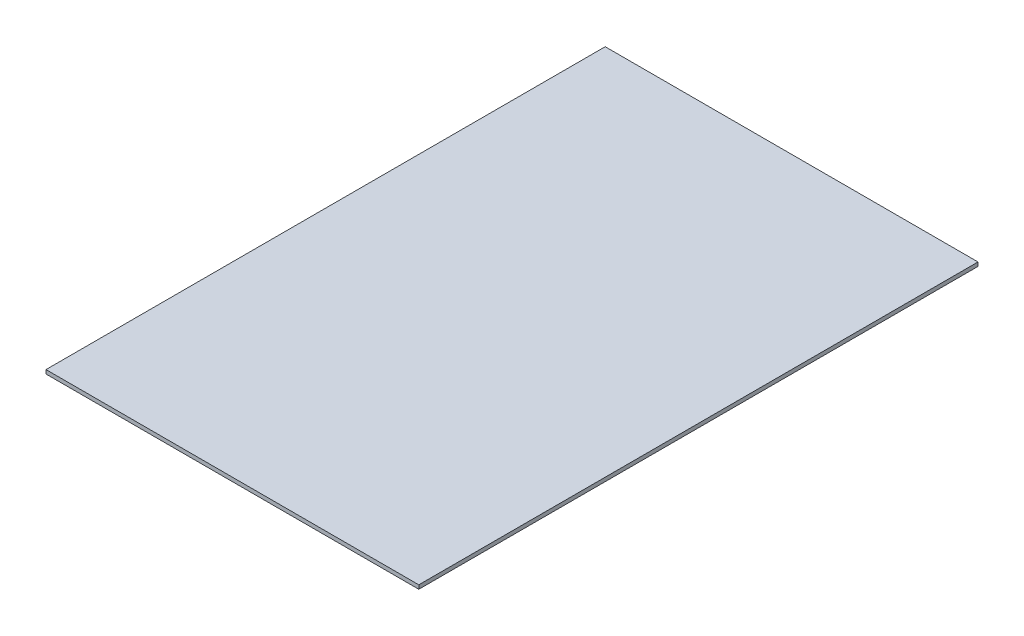
ISO-10303-21;
HEADER;
FILE_DESCRIPTION(('STEP AP214'),'2;1');
FILE_NAME('part.step','',(''),(''),'','','');
FILE_SCHEMA(('AUTOMOTIVE_DESIGN { 1 0 10303 214 1 1 1 1 }'));
ENDSEC;
DATA;
#1=APPLICATION_CONTEXT('core data for automotive mechanical design processes');
#2=APPLICATION_PROTOCOL_DEFINITION('international standard','automotive_design',2000,#1);
#3=PRODUCT_CONTEXT('',#1,'mechanical');
#4=PRODUCT('Part','Part','',(#3));
#5=PRODUCT_RELATED_PRODUCT_CATEGORY('part','',(#4));
#6=PRODUCT_DEFINITION_FORMATION('','',#4);
#7=PRODUCT_DEFINITION_CONTEXT('part definition',#1,'design');
#8=PRODUCT_DEFINITION('design','',#6,#7);
#9=PRODUCT_DEFINITION_SHAPE('','',#8);
#10=(LENGTH_UNIT() NAMED_UNIT(*) SI_UNIT(.MILLI.,.METRE.));
#11=(NAMED_UNIT(*) PLANE_ANGLE_UNIT() SI_UNIT($,.RADIAN.));
#12=(NAMED_UNIT(*) SI_UNIT($,.STERADIAN.) SOLID_ANGLE_UNIT());
#13=UNCERTAINTY_MEASURE_WITH_UNIT(LENGTH_MEASURE(1.E-05),#10,'distance_accuracy_value','');
#14=(GEOMETRIC_REPRESENTATION_CONTEXT(3) GLOBAL_UNCERTAINTY_ASSIGNED_CONTEXT((#13)) GLOBAL_UNIT_ASSIGNED_CONTEXT((#10,
#11,#12)) REPRESENTATION_CONTEXT('',''));
#15=CARTESIAN_POINT('',(0.,0.,0.));
#16=DIRECTION('',(0.,0.,1.));
#17=DIRECTION('',(1.,0.,0.));
#18=AXIS2_PLACEMENT_3D('',#15,#16,#17);
#19=CARTESIAN_POINT('',(304.8,6.35,457.2));
#20=DIRECTION('',(-1.,0.,0.));
#21=DIRECTION('',(0.,0.,1.));
#22=AXIS2_PLACEMENT_3D('',#19,#20,#21);
#23=PLANE('',#22);
#24=DIRECTION('',(0.,0.,-1.));
#25=VECTOR('',#24,1.);
#26=CARTESIAN_POINT('',(304.8,0.,457.2));
#27=LINE('',#26,#25);
#28=CARTESIAN_POINT('',(304.8,0.,457.2));
#29=VERTEX_POINT('',#28);
#30=CARTESIAN_POINT('',(304.8,0.,-457.2));
#31=VERTEX_POINT('',#30);
#32=EDGE_CURVE('E110',#29,#31,#27,.T.);
#33=ORIENTED_EDGE('',*,*,#32,.T.);
#34=DIRECTION('',(0.,-1.,0.));
#35=VECTOR('',#34,1.);
#36=CARTESIAN_POINT('',(304.8,6.35,-457.2));
#37=LINE('',#36,#35);
#38=CARTESIAN_POINT('',(304.8,6.35,-457.2));
#39=VERTEX_POINT('',#38);
#40=EDGE_CURVE('E11',#39,#31,#37,.T.);
#41=ORIENTED_EDGE('',*,*,#40,.F.);
#42=DIRECTION('',(0.,0.,-1.));
#43=VECTOR('',#42,1.);
#44=CARTESIAN_POINT('',(304.8,6.35,457.2));
#45=LINE('',#44,#43);
#46=CARTESIAN_POINT('',(304.8,6.35,457.2));
#47=VERTEX_POINT('',#46);
#48=EDGE_CURVE('E94',#47,#39,#45,.T.);
#49=ORIENTED_EDGE('',*,*,#48,.F.);
#50=DIRECTION('',(0.,-1.,0.));
#51=VECTOR('',#50,1.);
#52=CARTESIAN_POINT('',(304.8,6.35,457.2));
#53=LINE('',#52,#51);
#54=EDGE_CURVE('E106',#47,#29,#53,.T.);
#55=ORIENTED_EDGE('',*,*,#54,.T.);
#56=EDGE_LOOP('',(#33,#41,#49,#55));
#57=FACE_BOUND('',#56,.T.);
#58=ADVANCED_FACE('F42',(#57),#23,.F.);
#59=CARTESIAN_POINT('',(-304.8,6.35,-457.2));
#60=DIRECTION('',(0.,0.,1.));
#61=DIRECTION('',(1.,0.,0.));
#62=AXIS2_PLACEMENT_3D('',#59,#60,#61);
#63=PLANE('',#62);
#64=DIRECTION('',(-1.,0.,0.));
#65=VECTOR('',#64,1.);
#66=CARTESIAN_POINT('',(-304.8,0.,-457.2));
#67=LINE('',#66,#65);
#68=CARTESIAN_POINT('',(-304.8,0.,-457.2));
#69=VERTEX_POINT('',#68);
#70=EDGE_CURVE('E99',#31,#69,#67,.T.);
#71=ORIENTED_EDGE('',*,*,#70,.T.);
#72=DIRECTION('',(0.,-1.,0.));
#73=VECTOR('',#72,1.);
#74=CARTESIAN_POINT('',(-304.8,6.35,-457.2));
#75=LINE('',#74,#73);
#76=CARTESIAN_POINT('',(-304.8,6.35,-457.2));
#77=VERTEX_POINT('',#76);
#78=EDGE_CURVE('E51',#77,#69,#75,.T.);
#79=ORIENTED_EDGE('',*,*,#78,.F.);
#80=DIRECTION('',(-1.,0.,0.));
#81=VECTOR('',#80,1.);
#82=CARTESIAN_POINT('',(-304.8,6.35,-457.2));
#83=LINE('',#82,#81);
#84=EDGE_CURVE('E89',#39,#77,#83,.T.);
#85=ORIENTED_EDGE('',*,*,#84,.F.);
#86=ORIENTED_EDGE('',*,*,#40,.T.);
#87=EDGE_LOOP('',(#71,#79,#85,#86));
#88=FACE_BOUND('',#87,.T.);
#89=ADVANCED_FACE('F98',(#88),#63,.F.);
#90=CARTESIAN_POINT('',(-304.8,6.35,457.2));
#91=DIRECTION('',(1.,0.,0.));
#92=DIRECTION('',(0.,0.,-1.));
#93=AXIS2_PLACEMENT_3D('',#90,#91,#92);
#94=PLANE('',#93);
#95=DIRECTION('',(0.,0.,1.));
#96=VECTOR('',#95,1.);
#97=CARTESIAN_POINT('',(-304.8,0.,457.2));
#98=LINE('',#97,#96);
#99=CARTESIAN_POINT('',(-304.8,0.,457.2));
#100=VERTEX_POINT('',#99);
#101=EDGE_CURVE('E76',#69,#100,#98,.T.);
#102=ORIENTED_EDGE('',*,*,#101,.T.);
#103=DIRECTION('',(0.,-1.,0.));
#104=VECTOR('',#103,1.);
#105=CARTESIAN_POINT('',(-304.8,6.35,457.2));
#106=LINE('',#105,#104);
#107=CARTESIAN_POINT('',(-304.8,6.35,457.2));
#108=VERTEX_POINT('',#107);
#109=EDGE_CURVE('E101',#108,#100,#106,.T.);
#110=ORIENTED_EDGE('',*,*,#109,.F.);
#111=DIRECTION('',(0.,0.,1.));
#112=VECTOR('',#111,1.);
#113=CARTESIAN_POINT('',(-304.8,6.35,457.2));
#114=LINE('',#113,#112);
#115=EDGE_CURVE('E92',#77,#108,#114,.T.);
#116=ORIENTED_EDGE('',*,*,#115,.F.);
#117=ORIENTED_EDGE('',*,*,#78,.T.);
#118=EDGE_LOOP('',(#102,#110,#116,#117));
#119=FACE_BOUND('',#118,.T.);
#120=ADVANCED_FACE('F102',(#119),#94,.F.);
#121=CARTESIAN_POINT('',(-304.8,6.35,457.2));
#122=DIRECTION('',(0.,0.,-1.));
#123=DIRECTION('',(-1.,0.,0.));
#124=AXIS2_PLACEMENT_3D('',#121,#122,#123);
#125=PLANE('',#124);
#126=DIRECTION('',(1.,0.,0.));
#127=VECTOR('',#126,1.);
#128=CARTESIAN_POINT('',(-304.8,0.,457.2));
#129=LINE('',#128,#127);
#130=EDGE_CURVE('E82',#100,#29,#129,.T.);
#131=ORIENTED_EDGE('',*,*,#130,.T.);
#132=ORIENTED_EDGE('',*,*,#54,.F.);
#133=DIRECTION('',(1.,0.,0.));
#134=VECTOR('',#133,1.);
#135=CARTESIAN_POINT('',(-304.8,6.35,457.2));
#136=LINE('',#135,#134);
#137=EDGE_CURVE('E59',#108,#47,#136,.T.);
#138=ORIENTED_EDGE('',*,*,#137,.F.);
#139=ORIENTED_EDGE('',*,*,#109,.T.);
#140=EDGE_LOOP('',(#131,#132,#138,#139));
#141=FACE_BOUND('',#140,.T.);
#142=ADVANCED_FACE('F123',(#141),#125,.F.);
#143=CARTESIAN_POINT('',(0.,6.35,0.));
#144=DIRECTION('',(0.,-1.,0.));
#145=DIRECTION('',(0.,0.,-1.));
#146=AXIS2_PLACEMENT_3D('',#143,#144,#145);
#147=PLANE('',#146);
#148=ORIENTED_EDGE('',*,*,#48,.T.);
#149=ORIENTED_EDGE('',*,*,#84,.T.);
#150=ORIENTED_EDGE('',*,*,#115,.T.);
#151=ORIENTED_EDGE('',*,*,#137,.T.);
#152=EDGE_LOOP('',(#148,#149,#150,#151));
#153=FACE_BOUND('',#152,.T.);
#154=ADVANCED_FACE('F90',(#153),#147,.F.);
#155=CARTESIAN_POINT('',(0.,0.,0.));
#156=DIRECTION('',(0.,-1.,0.));
#157=DIRECTION('',(0.,0.,-1.));
#158=AXIS2_PLACEMENT_3D('',#155,#156,#157);
#159=PLANE('',#158);
#160=ORIENTED_EDGE('',*,*,#32,.F.);
#161=ORIENTED_EDGE('',*,*,#130,.F.);
#162=ORIENTED_EDGE('',*,*,#101,.F.);
#163=ORIENTED_EDGE('',*,*,#70,.F.);
#164=EDGE_LOOP('',(#160,#161,#162,#163));
#165=FACE_BOUND('',#164,.T.);
#166=ADVANCED_FACE('F126',(#165),#159,.T.);
#167=CLOSED_SHELL('',(#58,#89,#120,#142,#154,#166));
#168=MANIFOLD_SOLID_BREP('B2',#167);
#169=ADVANCED_BREP_SHAPE_REPRESENTATION('',(#18,#168),#14);
#170=SHAPE_DEFINITION_REPRESENTATION(#9,#169);
ENDSEC;
END-ISO-10303-21;
